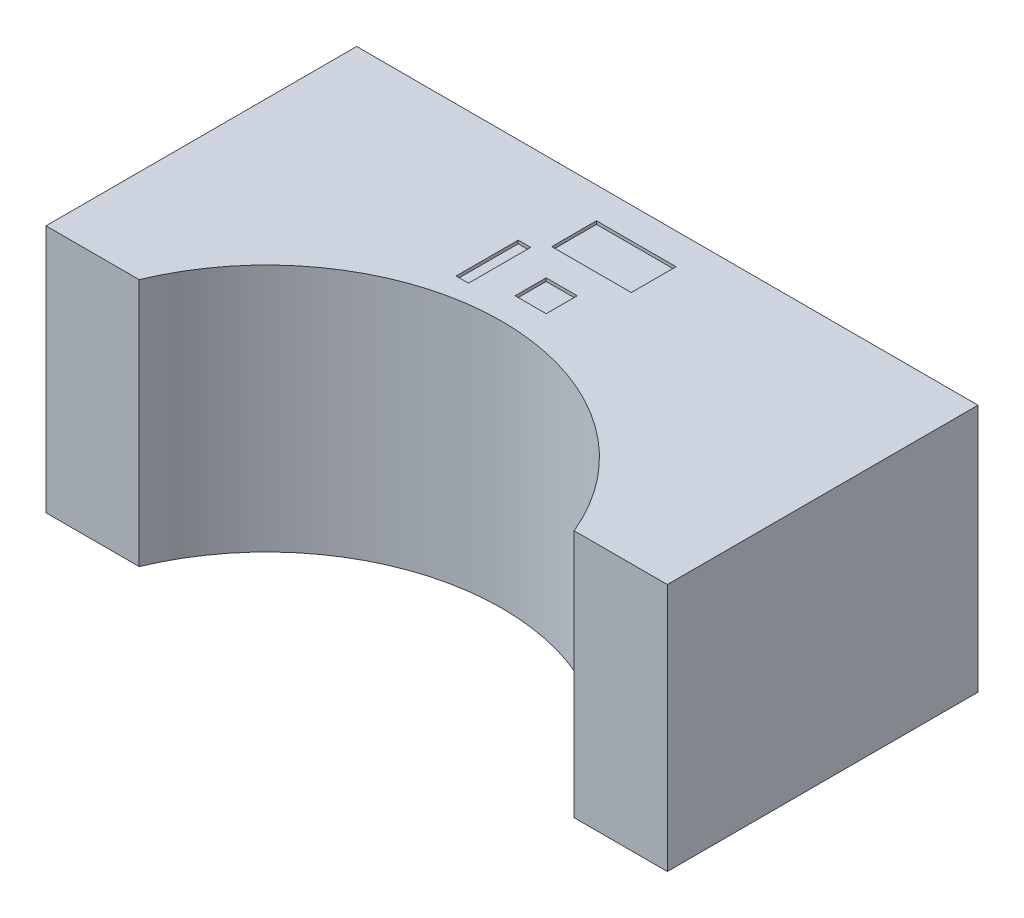
ISO-10303-21;
HEADER;
FILE_DESCRIPTION(('STEP AP214'),'2;1');
FILE_NAME('part.step','',(''),(''),'','','');
FILE_SCHEMA(('AUTOMOTIVE_DESIGN { 1 0 10303 214 1 1 1 1 }'));
ENDSEC;
DATA;
#1=APPLICATION_CONTEXT('core data for automotive mechanical design processes');
#2=APPLICATION_PROTOCOL_DEFINITION('international standard','automotive_design',2000,#1);
#3=PRODUCT_CONTEXT('',#1,'mechanical');
#4=PRODUCT('Part','Part','',(#3));
#5=PRODUCT_RELATED_PRODUCT_CATEGORY('part','',(#4));
#6=PRODUCT_DEFINITION_FORMATION('','',#4);
#7=PRODUCT_DEFINITION_CONTEXT('part definition',#1,'design');
#8=PRODUCT_DEFINITION('design','',#6,#7);
#9=PRODUCT_DEFINITION_SHAPE('','',#8);
#10=(LENGTH_UNIT() NAMED_UNIT(*) SI_UNIT(.MILLI.,.METRE.));
#11=(NAMED_UNIT(*) PLANE_ANGLE_UNIT() SI_UNIT($,.RADIAN.));
#12=(NAMED_UNIT(*) SI_UNIT($,.STERADIAN.) SOLID_ANGLE_UNIT());
#13=UNCERTAINTY_MEASURE_WITH_UNIT(LENGTH_MEASURE(1.E-05),#10,'distance_accuracy_value','');
#14=(GEOMETRIC_REPRESENTATION_CONTEXT(3) GLOBAL_UNCERTAINTY_ASSIGNED_CONTEXT((#13)) GLOBAL_UNIT_ASSIGNED_CONTEXT((#10,
#11,#12)) REPRESENTATION_CONTEXT('',''));
#15=CARTESIAN_POINT('',(0.,0.,0.));
#16=DIRECTION('',(0.,0.,1.));
#17=DIRECTION('',(1.,0.,0.));
#18=AXIS2_PLACEMENT_3D('',#15,#16,#17);
#19=CARTESIAN_POINT('',(-500.,400.,0.));
#20=DIRECTION('',(1.,0.,0.));
#21=DIRECTION('',(0.,0.,-1.));
#22=AXIS2_PLACEMENT_3D('',#19,#20,#21);
#23=PLANE('',#22);
#24=DIRECTION('',(0.,0.,1.));
#25=VECTOR('',#24,1.);
#26=CARTESIAN_POINT('',(-500.,0.,0.));
#27=LINE('',#26,#25);
#28=CARTESIAN_POINT('',(-500.,0.,0.));
#29=VERTEX_POINT('',#28);
#30=CARTESIAN_POINT('',(-500.,0.,500.));
#31=VERTEX_POINT('',#30);
#32=EDGE_CURVE('E253',#29,#31,#27,.T.);
#33=ORIENTED_EDGE('',*,*,#32,.T.);
#34=DIRECTION('',(0.,-1.,0.));
#35=VECTOR('',#34,1.);
#36=CARTESIAN_POINT('',(-500.,400.,500.));
#37=LINE('',#36,#35);
#38=CARTESIAN_POINT('',(-500.,400.,500.));
#39=VERTEX_POINT('',#38);
#40=EDGE_CURVE('E42',#39,#31,#37,.T.);
#41=ORIENTED_EDGE('',*,*,#40,.F.);
#42=DIRECTION('',(0.,0.,1.));
#43=VECTOR('',#42,1.);
#44=CARTESIAN_POINT('',(-500.,400.,0.));
#45=LINE('',#44,#43);
#46=CARTESIAN_POINT('',(-500.,400.,0.));
#47=VERTEX_POINT('',#46);
#48=EDGE_CURVE('E263',#47,#39,#45,.T.);
#49=ORIENTED_EDGE('',*,*,#48,.F.);
#50=DIRECTION('',(0.,-1.,0.));
#51=VECTOR('',#50,1.);
#52=CARTESIAN_POINT('',(-500.,400.,0.));
#53=LINE('',#52,#51);
#54=EDGE_CURVE('E11',#47,#29,#53,.T.);
#55=ORIENTED_EDGE('',*,*,#54,.T.);
#56=EDGE_LOOP('',(#33,#41,#49,#55));
#57=FACE_BOUND('',#56,.T.);
#58=ADVANCED_FACE('F35',(#57),#23,.F.);
#59=CARTESIAN_POINT('',(-500.,400.,500.));
#60=DIRECTION('',(0.,0.,-1.));
#61=DIRECTION('',(-1.,0.,0.));
#62=AXIS2_PLACEMENT_3D('',#59,#60,#61);
#63=PLANE('',#62);
#64=DIRECTION('',(1.,0.,0.));
#65=VECTOR('',#64,1.);
#66=CARTESIAN_POINT('',(-500.,0.,500.));
#67=LINE('',#66,#65);
#68=CARTESIAN_POINT('',(-350.,0.,500.));
#69=VERTEX_POINT('',#68);
#70=EDGE_CURVE('E277',#31,#69,#67,.T.);
#71=ORIENTED_EDGE('',*,*,#70,.T.);
#72=DIRECTION('',(0.,-1.,0.));
#73=VECTOR('',#72,1.);
#74=CARTESIAN_POINT('',(-350.,400.,500.));
#75=LINE('',#74,#73);
#76=CARTESIAN_POINT('',(-350.,400.,500.));
#77=VERTEX_POINT('',#76);
#78=EDGE_CURVE('E294',#77,#69,#75,.T.);
#79=ORIENTED_EDGE('',*,*,#78,.F.);
#80=DIRECTION('',(1.,0.,0.));
#81=VECTOR('',#80,1.);
#82=CARTESIAN_POINT('',(-500.,400.,500.));
#83=LINE('',#82,#81);
#84=EDGE_CURVE('E266',#39,#77,#83,.T.);
#85=ORIENTED_EDGE('',*,*,#84,.F.);
#86=ORIENTED_EDGE('',*,*,#40,.T.);
#87=EDGE_LOOP('',(#71,#79,#85,#86));
#88=FACE_BOUND('',#87,.T.);
#89=ADVANCED_FACE('F301',(#88),#63,.F.);
#90=CARTESIAN_POINT('',(1.38777878078145E-13,400.,644.974746830582));
#91=DIRECTION('',(0.,-1.,0.));
#92=DIRECTION('',(0.,0.,-1.));
#93=AXIS2_PLACEMENT_3D('',#90,#91,#92);
#94=CYLINDRICAL_SURFACE('',#93,378.837270102337);
#95=CARTESIAN_POINT('',(1.38777878078145E-13,0.,644.974746830582));
#96=DIRECTION('',(0.,-1.,0.));
#97=DIRECTION('',(0.,0.,-1.));
#98=AXIS2_PLACEMENT_3D('',#95,#96,#97);
#99=CIRCLE('',#98,378.837270102337);
#100=CARTESIAN_POINT('',(350.,0.,500.));
#101=VERTEX_POINT('',#100);
#102=EDGE_CURVE('E279',#69,#101,#99,.T.);
#103=ORIENTED_EDGE('',*,*,#102,.T.);
#104=DIRECTION('',(0.,-1.,0.));
#105=VECTOR('',#104,1.);
#106=CARTESIAN_POINT('',(350.,400.,500.));
#107=LINE('',#106,#105);
#108=CARTESIAN_POINT('',(350.,400.,500.));
#109=VERTEX_POINT('',#108);
#110=EDGE_CURVE('E291',#109,#101,#107,.T.);
#111=ORIENTED_EDGE('',*,*,#110,.F.);
#112=CARTESIAN_POINT('',(1.38777878078145E-13,400.,644.974746830582));
#113=DIRECTION('',(0.,-1.,0.));
#114=DIRECTION('',(0.,0.,-1.));
#115=AXIS2_PLACEMENT_3D('',#112,#113,#114);
#116=CIRCLE('',#115,378.837270102337);
#117=EDGE_CURVE('E268',#77,#109,#116,.T.);
#118=ORIENTED_EDGE('',*,*,#117,.F.);
#119=ORIENTED_EDGE('',*,*,#78,.T.);
#120=EDGE_LOOP('',(#103,#111,#118,#119));
#121=FACE_BOUND('',#120,.T.);
#122=ADVANCED_FACE('F313',(#121),#94,.F.);
#123=CARTESIAN_POINT('',(500.,400.,500.));
#124=DIRECTION('',(0.,0.,-1.));
#125=DIRECTION('',(-1.,0.,0.));
#126=AXIS2_PLACEMENT_3D('',#123,#124,#125);
#127=PLANE('',#126);
#128=DIRECTION('',(1.,0.,0.));
#129=VECTOR('',#128,1.);
#130=CARTESIAN_POINT('',(500.,0.,500.));
#131=LINE('',#130,#129);
#132=CARTESIAN_POINT('',(500.,0.,500.));
#133=VERTEX_POINT('',#132);
#134=EDGE_CURVE('E281',#101,#133,#131,.T.);
#135=ORIENTED_EDGE('',*,*,#134,.T.);
#136=DIRECTION('',(0.,-1.,0.));
#137=VECTOR('',#136,1.);
#138=CARTESIAN_POINT('',(500.,400.,500.));
#139=LINE('',#138,#137);
#140=CARTESIAN_POINT('',(500.,400.,500.));
#141=VERTEX_POINT('',#140);
#142=EDGE_CURVE('E288',#141,#133,#139,.T.);
#143=ORIENTED_EDGE('',*,*,#142,.F.);
#144=DIRECTION('',(1.,0.,0.));
#145=VECTOR('',#144,1.);
#146=CARTESIAN_POINT('',(500.,400.,500.));
#147=LINE('',#146,#145);
#148=EDGE_CURVE('E270',#109,#141,#147,.T.);
#149=ORIENTED_EDGE('',*,*,#148,.F.);
#150=ORIENTED_EDGE('',*,*,#110,.T.);
#151=EDGE_LOOP('',(#135,#143,#149,#150));
#152=FACE_BOUND('',#151,.T.);
#153=ADVANCED_FACE('F317',(#152),#127,.F.);
#154=CARTESIAN_POINT('',(500.,400.,0.));
#155=DIRECTION('',(-1.,0.,0.));
#156=DIRECTION('',(0.,0.,1.));
#157=AXIS2_PLACEMENT_3D('',#154,#155,#156);
#158=PLANE('',#157);
#159=DIRECTION('',(0.,0.,-1.));
#160=VECTOR('',#159,1.);
#161=CARTESIAN_POINT('',(500.,0.,0.));
#162=LINE('',#161,#160);
#163=CARTESIAN_POINT('',(500.,0.,0.));
#164=VERTEX_POINT('',#163);
#165=EDGE_CURVE('E283',#133,#164,#162,.T.);
#166=ORIENTED_EDGE('',*,*,#165,.T.);
#167=DIRECTION('',(0.,-1.,0.));
#168=VECTOR('',#167,1.);
#169=CARTESIAN_POINT('',(500.,400.,0.));
#170=LINE('',#169,#168);
#171=CARTESIAN_POINT('',(500.,400.,0.));
#172=VERTEX_POINT('',#171);
#173=EDGE_CURVE('E275',#172,#164,#170,.T.);
#174=ORIENTED_EDGE('',*,*,#173,.F.);
#175=DIRECTION('',(0.,0.,-1.));
#176=VECTOR('',#175,1.);
#177=CARTESIAN_POINT('',(500.,400.,0.));
#178=LINE('',#177,#176);
#179=EDGE_CURVE('E272',#141,#172,#178,.T.);
#180=ORIENTED_EDGE('',*,*,#179,.F.);
#181=ORIENTED_EDGE('',*,*,#142,.T.);
#182=EDGE_LOOP('',(#166,#174,#180,#181));
#183=FACE_BOUND('',#182,.T.);
#184=ADVANCED_FACE('F327',(#183),#158,.F.);
#185=CARTESIAN_POINT('',(0.,400.,0.));
#186=DIRECTION('',(0.,0.,1.));
#187=DIRECTION('',(1.,0.,0.));
#188=AXIS2_PLACEMENT_3D('',#185,#186,#187);
#189=PLANE('',#188);
#190=DIRECTION('',(-1.,0.,0.));
#191=VECTOR('',#190,1.);
#192=CARTESIAN_POINT('',(0.,0.,0.));
#193=LINE('',#192,#191);
#194=EDGE_CURVE('E264',#164,#29,#193,.T.);
#195=ORIENTED_EDGE('',*,*,#194,.T.);
#196=ORIENTED_EDGE('',*,*,#54,.F.);
#197=DIRECTION('',(-1.,0.,0.));
#198=VECTOR('',#197,1.);
#199=CARTESIAN_POINT('',(0.,400.,0.));
#200=LINE('',#199,#198);
#201=EDGE_CURVE('E260',#172,#47,#200,.T.);
#202=ORIENTED_EDGE('',*,*,#201,.F.);
#203=ORIENTED_EDGE('',*,*,#173,.T.);
#204=EDGE_LOOP('',(#195,#196,#202,#203));
#205=FACE_BOUND('',#204,.T.);
#206=ADVANCED_FACE('F325',(#205),#189,.F.);
#207=CARTESIAN_POINT('',(1.38777878078145E-13,400.,644.974746830582));
#208=DIRECTION('',(0.,-1.,0.));
#209=DIRECTION('',(0.,0.,-1.));
#210=AXIS2_PLACEMENT_3D('',#207,#208,#209);
#211=PLANE('',#210);
#212=DIRECTION('',(1.,0.,0.));
#213=VECTOR('',#212,1.);
#214=CARTESIAN_POINT('',(-100.,400.,240.));
#215=LINE('',#214,#213);
#216=CARTESIAN_POINT('',(-100.,400.,240.));
#217=VERTEX_POINT('',#216);
#218=CARTESIAN_POINT('',(-80.,400.,240.));
#219=VERTEX_POINT('',#218);
#220=EDGE_CURVE('E188',#217,#219,#215,.T.);
#221=ORIENTED_EDGE('',*,*,#220,.F.);
#222=DIRECTION('',(0.,0.,1.));
#223=VECTOR('',#222,1.);
#224=CARTESIAN_POINT('',(-100.,400.,140.));
#225=LINE('',#224,#223);
#226=CARTESIAN_POINT('',(-100.,400.,140.));
#227=VERTEX_POINT('',#226);
#228=EDGE_CURVE('E49',#227,#217,#225,.T.);
#229=ORIENTED_EDGE('',*,*,#228,.F.);
#230=DIRECTION('',(-1.,0.,0.));
#231=VECTOR('',#230,1.);
#232=CARTESIAN_POINT('',(-100.,400.,140.));
#233=LINE('',#232,#231);
#234=CARTESIAN_POINT('',(-80.,400.,140.));
#235=VERTEX_POINT('',#234);
#236=EDGE_CURVE('E179',#235,#227,#233,.T.);
#237=ORIENTED_EDGE('',*,*,#236,.F.);
#238=DIRECTION('',(0.,0.,-1.));
#239=VECTOR('',#238,1.);
#240=CARTESIAN_POINT('',(-80.,400.,140.));
#241=LINE('',#240,#239);
#242=EDGE_CURVE('E182',#219,#235,#241,.T.);
#243=ORIENTED_EDGE('',*,*,#242,.F.);
#244=EDGE_LOOP('',(#221,#229,#237,#243));
#245=FACE_BOUND('',#244,.T.);
#246=DIRECTION('',(1.,0.,0.));
#247=VECTOR('',#246,1.);
#248=CARTESIAN_POINT('',(-25.,400.,220.));
#249=LINE('',#248,#247);
#250=CARTESIAN_POINT('',(-25.,400.,220.));
#251=VERTEX_POINT('',#250);
#252=CARTESIAN_POINT('',(25.,400.,220.));
#253=VERTEX_POINT('',#252);
#254=EDGE_CURVE('E212',#251,#253,#249,.T.);
#255=ORIENTED_EDGE('',*,*,#254,.F.);
#256=DIRECTION('',(0.,0.,1.));
#257=VECTOR('',#256,1.);
#258=CARTESIAN_POINT('',(-25.,400.,170.));
#259=LINE('',#258,#257);
#260=CARTESIAN_POINT('',(-25.,400.,170.));
#261=VERTEX_POINT('',#260);
#262=EDGE_CURVE('E57',#261,#251,#259,.T.);
#263=ORIENTED_EDGE('',*,*,#262,.F.);
#264=DIRECTION('',(-1.,0.,0.));
#265=VECTOR('',#264,1.);
#266=CARTESIAN_POINT('',(-25.,400.,170.));
#267=LINE('',#266,#265);
#268=CARTESIAN_POINT('',(25.,400.,170.));
#269=VERTEX_POINT('',#268);
#270=EDGE_CURVE('E201',#269,#261,#267,.T.);
#271=ORIENTED_EDGE('',*,*,#270,.F.);
#272=DIRECTION('',(0.,0.,-1.));
#273=VECTOR('',#272,1.);
#274=CARTESIAN_POINT('',(25.,400.,170.));
#275=LINE('',#274,#273);
#276=EDGE_CURVE('E215',#253,#269,#275,.T.);
#277=ORIENTED_EDGE('',*,*,#276,.F.);
#278=EDGE_LOOP('',(#255,#263,#271,#277));
#279=FACE_BOUND('',#278,.T.);
#280=DIRECTION('',(1.,0.,0.));
#281=VECTOR('',#280,1.);
#282=CARTESIAN_POINT('',(-64.,400.,122.));
#283=LINE('',#282,#281);
#284=CARTESIAN_POINT('',(-64.,400.,122.));
#285=VERTEX_POINT('',#284);
#286=CARTESIAN_POINT('',(64.,400.,122.));
#287=VERTEX_POINT('',#286);
#288=EDGE_CURVE('E243',#285,#287,#283,.T.);
#289=ORIENTED_EDGE('',*,*,#288,.F.);
#290=DIRECTION('',(0.,0.,1.));
#291=VECTOR('',#290,1.);
#292=CARTESIAN_POINT('',(-64.,400.,50.));
#293=LINE('',#292,#291);
#294=CARTESIAN_POINT('',(-64.,400.,50.));
#295=VERTEX_POINT('',#294);
#296=EDGE_CURVE('E222',#295,#285,#293,.T.);
#297=ORIENTED_EDGE('',*,*,#296,.F.);
#298=DIRECTION('',(-1.,0.,0.));
#299=VECTOR('',#298,1.);
#300=CARTESIAN_POINT('',(-64.,400.,50.));
#301=LINE('',#300,#299);
#302=CARTESIAN_POINT('',(64.,400.,50.));
#303=VERTEX_POINT('',#302);
#304=EDGE_CURVE('E232',#303,#295,#301,.T.);
#305=ORIENTED_EDGE('',*,*,#304,.F.);
#306=DIRECTION('',(0.,0.,-1.));
#307=VECTOR('',#306,1.);
#308=CARTESIAN_POINT('',(64.,400.,122.));
#309=LINE('',#308,#307);
#310=EDGE_CURVE('E246',#287,#303,#309,.T.);
#311=ORIENTED_EDGE('',*,*,#310,.F.);
#312=EDGE_LOOP('',(#289,#297,#305,#311));
#313=FACE_BOUND('',#312,.T.);
#314=ORIENTED_EDGE('',*,*,#201,.T.);
#315=ORIENTED_EDGE('',*,*,#48,.T.);
#316=ORIENTED_EDGE('',*,*,#84,.T.);
#317=ORIENTED_EDGE('',*,*,#117,.T.);
#318=ORIENTED_EDGE('',*,*,#148,.T.);
#319=ORIENTED_EDGE('',*,*,#179,.T.);
#320=EDGE_LOOP('',(#314,#315,#316,#317,#318,#319));
#321=FACE_BOUND('',#320,.T.);
#322=ADVANCED_FACE('F321',(#245,#279,#313,#321),#211,.F.);
#323=CARTESIAN_POINT('',(1.38777878078145E-13,0.,644.974746830582));
#324=DIRECTION('',(0.,-1.,0.));
#325=DIRECTION('',(0.,0.,-1.));
#326=AXIS2_PLACEMENT_3D('',#323,#324,#325);
#327=PLANE('',#326);
#328=ORIENTED_EDGE('',*,*,#32,.F.);
#329=ORIENTED_EDGE('',*,*,#194,.F.);
#330=ORIENTED_EDGE('',*,*,#165,.F.);
#331=ORIENTED_EDGE('',*,*,#134,.F.);
#332=ORIENTED_EDGE('',*,*,#102,.F.);
#333=ORIENTED_EDGE('',*,*,#70,.F.);
#334=EDGE_LOOP('',(#328,#329,#330,#331,#332,#333));
#335=FACE_BOUND('',#334,.T.);
#336=ADVANCED_FACE('F307',(#335),#327,.T.);
#337=CARTESIAN_POINT('',(-64.,395.,50.));
#338=DIRECTION('',(-1.,0.,0.));
#339=DIRECTION('',(0.,0.,1.));
#340=AXIS2_PLACEMENT_3D('',#337,#338,#339);
#341=PLANE('',#340);
#342=ORIENTED_EDGE('',*,*,#296,.T.);
#343=DIRECTION('',(0.,1.,0.));
#344=VECTOR('',#343,1.);
#345=CARTESIAN_POINT('',(-64.,395.,122.));
#346=LINE('',#345,#344);
#347=CARTESIAN_POINT('',(-64.,395.,122.));
#348=VERTEX_POINT('',#347);
#349=EDGE_CURVE('E241',#348,#285,#346,.T.);
#350=ORIENTED_EDGE('',*,*,#349,.F.);
#351=DIRECTION('',(0.,0.,1.));
#352=VECTOR('',#351,1.);
#353=CARTESIAN_POINT('',(-64.,395.,50.));
#354=LINE('',#353,#352);
#355=CARTESIAN_POINT('',(-64.,395.,50.));
#356=VERTEX_POINT('',#355);
#357=EDGE_CURVE('E228',#356,#348,#354,.T.);
#358=ORIENTED_EDGE('',*,*,#357,.F.);
#359=DIRECTION('',(0.,1.,0.));
#360=VECTOR('',#359,1.);
#361=CARTESIAN_POINT('',(-64.,395.,50.));
#362=LINE('',#361,#360);
#363=EDGE_CURVE('E251',#356,#295,#362,.T.);
#364=ORIENTED_EDGE('',*,*,#363,.T.);
#365=EDGE_LOOP('',(#342,#350,#358,#364));
#366=FACE_BOUND('',#365,.T.);
#367=ADVANCED_FACE('F372',(#366),#341,.F.);
#368=CARTESIAN_POINT('',(-64.,395.,50.));
#369=DIRECTION('',(0.,0.,-1.));
#370=DIRECTION('',(-1.,0.,0.));
#371=AXIS2_PLACEMENT_3D('',#368,#369,#370);
#372=PLANE('',#371);
#373=ORIENTED_EDGE('',*,*,#304,.T.);
#374=ORIENTED_EDGE('',*,*,#363,.F.);
#375=DIRECTION('',(-1.,0.,0.));
#376=VECTOR('',#375,1.);
#377=CARTESIAN_POINT('',(-64.,395.,50.));
#378=LINE('',#377,#376);
#379=CARTESIAN_POINT('',(64.,395.,50.));
#380=VERTEX_POINT('',#379);
#381=EDGE_CURVE('E238',#380,#356,#378,.T.);
#382=ORIENTED_EDGE('',*,*,#381,.F.);
#383=DIRECTION('',(0.,1.,0.));
#384=VECTOR('',#383,1.);
#385=CARTESIAN_POINT('',(64.,395.,50.));
#386=LINE('',#385,#384);
#387=EDGE_CURVE('E254',#380,#303,#386,.T.);
#388=ORIENTED_EDGE('',*,*,#387,.T.);
#389=EDGE_LOOP('',(#373,#374,#382,#388));
#390=FACE_BOUND('',#389,.T.);
#391=ADVANCED_FACE('F381',(#390),#372,.F.);
#392=CARTESIAN_POINT('',(64.,395.,122.));
#393=DIRECTION('',(1.,0.,0.));
#394=DIRECTION('',(0.,0.,-1.));
#395=AXIS2_PLACEMENT_3D('',#392,#393,#394);
#396=PLANE('',#395);
#397=ORIENTED_EDGE('',*,*,#310,.T.);
#398=ORIENTED_EDGE('',*,*,#387,.F.);
#399=DIRECTION('',(0.,0.,-1.));
#400=VECTOR('',#399,1.);
#401=CARTESIAN_POINT('',(64.,395.,122.));
#402=LINE('',#401,#400);
#403=CARTESIAN_POINT('',(64.,395.,122.));
#404=VERTEX_POINT('',#403);
#405=EDGE_CURVE('E235',#404,#380,#402,.T.);
#406=ORIENTED_EDGE('',*,*,#405,.F.);
#407=DIRECTION('',(0.,1.,0.));
#408=VECTOR('',#407,1.);
#409=CARTESIAN_POINT('',(64.,395.,122.));
#410=LINE('',#409,#408);
#411=EDGE_CURVE('E256',#404,#287,#410,.T.);
#412=ORIENTED_EDGE('',*,*,#411,.T.);
#413=EDGE_LOOP('',(#397,#398,#406,#412));
#414=FACE_BOUND('',#413,.T.);
#415=ADVANCED_FACE('F391',(#414),#396,.F.);
#416=CARTESIAN_POINT('',(-64.,395.,122.));
#417=DIRECTION('',(0.,0.,1.));
#418=DIRECTION('',(1.,0.,0.));
#419=AXIS2_PLACEMENT_3D('',#416,#417,#418);
#420=PLANE('',#419);
#421=ORIENTED_EDGE('',*,*,#288,.T.);
#422=ORIENTED_EDGE('',*,*,#411,.F.);
#423=DIRECTION('',(1.,0.,0.));
#424=VECTOR('',#423,1.);
#425=CARTESIAN_POINT('',(-64.,395.,122.));
#426=LINE('',#425,#424);
#427=EDGE_CURVE('E231',#348,#404,#426,.T.);
#428=ORIENTED_EDGE('',*,*,#427,.F.);
#429=ORIENTED_EDGE('',*,*,#349,.T.);
#430=EDGE_LOOP('',(#421,#422,#428,#429));
#431=FACE_BOUND('',#430,.T.);
#432=ADVANCED_FACE('F401',(#431),#420,.F.);
#433=CARTESIAN_POINT('',(0.,395.,0.));
#434=DIRECTION('',(0.,1.,0.));
#435=DIRECTION('',(0.,0.,1.));
#436=AXIS2_PLACEMENT_3D('',#433,#434,#435);
#437=PLANE('',#436);
#438=ORIENTED_EDGE('',*,*,#357,.T.);
#439=ORIENTED_EDGE('',*,*,#427,.T.);
#440=ORIENTED_EDGE('',*,*,#405,.T.);
#441=ORIENTED_EDGE('',*,*,#381,.T.);
#442=EDGE_LOOP('',(#438,#439,#440,#441));
#443=FACE_BOUND('',#442,.T.);
#444=ADVANCED_FACE('F411',(#443),#437,.T.);
#445=CARTESIAN_POINT('',(-25.,395.,170.));
#446=DIRECTION('',(-1.,0.,0.));
#447=DIRECTION('',(0.,0.,1.));
#448=AXIS2_PLACEMENT_3D('',#445,#446,#447);
#449=PLANE('',#448);
#450=ORIENTED_EDGE('',*,*,#262,.T.);
#451=DIRECTION('',(0.,1.,0.));
#452=VECTOR('',#451,1.);
#453=CARTESIAN_POINT('',(-25.,395.,220.));
#454=LINE('',#453,#452);
#455=CARTESIAN_POINT('',(-25.,395.,220.));
#456=VERTEX_POINT('',#455);
#457=EDGE_CURVE('E210',#456,#251,#454,.T.);
#458=ORIENTED_EDGE('',*,*,#457,.F.);
#459=DIRECTION('',(0.,0.,1.));
#460=VECTOR('',#459,1.);
#461=CARTESIAN_POINT('',(-25.,395.,170.));
#462=LINE('',#461,#460);
#463=CARTESIAN_POINT('',(-25.,395.,170.));
#464=VERTEX_POINT('',#463);
#465=EDGE_CURVE('E197',#464,#456,#462,.T.);
#466=ORIENTED_EDGE('',*,*,#465,.F.);
#467=DIRECTION('',(0.,1.,0.));
#468=VECTOR('',#467,1.);
#469=CARTESIAN_POINT('',(-25.,395.,170.));
#470=LINE('',#469,#468);
#471=EDGE_CURVE('E220',#464,#261,#470,.T.);
#472=ORIENTED_EDGE('',*,*,#471,.T.);
#473=EDGE_LOOP('',(#450,#458,#466,#472));
#474=FACE_BOUND('',#473,.T.);
#475=ADVANCED_FACE('F421',(#474),#449,.F.);
#476=CARTESIAN_POINT('',(-25.,395.,170.));
#477=DIRECTION('',(0.,0.,-1.));
#478=DIRECTION('',(-1.,0.,0.));
#479=AXIS2_PLACEMENT_3D('',#476,#477,#478);
#480=PLANE('',#479);
#481=ORIENTED_EDGE('',*,*,#270,.T.);
#482=ORIENTED_EDGE('',*,*,#471,.F.);
#483=DIRECTION('',(-1.,0.,0.));
#484=VECTOR('',#483,1.);
#485=CARTESIAN_POINT('',(-25.,395.,170.));
#486=LINE('',#485,#484);
#487=CARTESIAN_POINT('',(25.,395.,170.));
#488=VERTEX_POINT('',#487);
#489=EDGE_CURVE('E207',#488,#464,#486,.T.);
#490=ORIENTED_EDGE('',*,*,#489,.F.);
#491=DIRECTION('',(0.,1.,0.));
#492=VECTOR('',#491,1.);
#493=CARTESIAN_POINT('',(25.,395.,170.));
#494=LINE('',#493,#492);
#495=EDGE_CURVE('E223',#488,#269,#494,.T.);
#496=ORIENTED_EDGE('',*,*,#495,.T.);
#497=EDGE_LOOP('',(#481,#482,#490,#496));
#498=FACE_BOUND('',#497,.T.);
#499=ADVANCED_FACE('F431',(#498),#480,.F.);
#500=CARTESIAN_POINT('',(25.,395.,170.));
#501=DIRECTION('',(1.,0.,0.));
#502=DIRECTION('',(0.,0.,-1.));
#503=AXIS2_PLACEMENT_3D('',#500,#501,#502);
#504=PLANE('',#503);
#505=ORIENTED_EDGE('',*,*,#276,.T.);
#506=ORIENTED_EDGE('',*,*,#495,.F.);
#507=DIRECTION('',(0.,0.,-1.));
#508=VECTOR('',#507,1.);
#509=CARTESIAN_POINT('',(25.,395.,170.));
#510=LINE('',#509,#508);
#511=CARTESIAN_POINT('',(25.,395.,220.));
#512=VERTEX_POINT('',#511);
#513=EDGE_CURVE('E204',#512,#488,#510,.T.);
#514=ORIENTED_EDGE('',*,*,#513,.F.);
#515=DIRECTION('',(0.,1.,0.));
#516=VECTOR('',#515,1.);
#517=CARTESIAN_POINT('',(25.,395.,220.));
#518=LINE('',#517,#516);
#519=EDGE_CURVE('E225',#512,#253,#518,.T.);
#520=ORIENTED_EDGE('',*,*,#519,.T.);
#521=EDGE_LOOP('',(#505,#506,#514,#520));
#522=FACE_BOUND('',#521,.T.);
#523=ADVANCED_FACE('F440',(#522),#504,.F.);
#524=CARTESIAN_POINT('',(-25.,395.,220.));
#525=DIRECTION('',(0.,0.,1.));
#526=DIRECTION('',(1.,0.,0.));
#527=AXIS2_PLACEMENT_3D('',#524,#525,#526);
#528=PLANE('',#527);
#529=ORIENTED_EDGE('',*,*,#254,.T.);
#530=ORIENTED_EDGE('',*,*,#519,.F.);
#531=DIRECTION('',(1.,0.,0.));
#532=VECTOR('',#531,1.);
#533=CARTESIAN_POINT('',(-25.,395.,220.));
#534=LINE('',#533,#532);
#535=EDGE_CURVE('E200',#456,#512,#534,.T.);
#536=ORIENTED_EDGE('',*,*,#535,.F.);
#537=ORIENTED_EDGE('',*,*,#457,.T.);
#538=EDGE_LOOP('',(#529,#530,#536,#537));
#539=FACE_BOUND('',#538,.T.);
#540=ADVANCED_FACE('F450',(#539),#528,.F.);
#541=CARTESIAN_POINT('',(0.,395.,0.));
#542=DIRECTION('',(0.,1.,0.));
#543=DIRECTION('',(0.,0.,1.));
#544=AXIS2_PLACEMENT_3D('',#541,#542,#543);
#545=PLANE('',#544);
#546=ORIENTED_EDGE('',*,*,#465,.T.);
#547=ORIENTED_EDGE('',*,*,#535,.T.);
#548=ORIENTED_EDGE('',*,*,#513,.T.);
#549=ORIENTED_EDGE('',*,*,#489,.T.);
#550=EDGE_LOOP('',(#546,#547,#548,#549));
#551=FACE_BOUND('',#550,.T.);
#552=ADVANCED_FACE('F460',(#551),#545,.T.);
#553=CARTESIAN_POINT('',(-100.,395.,140.));
#554=DIRECTION('',(-1.,0.,0.));
#555=DIRECTION('',(0.,0.,1.));
#556=AXIS2_PLACEMENT_3D('',#553,#554,#555);
#557=PLANE('',#556);
#558=ORIENTED_EDGE('',*,*,#228,.T.);
#559=DIRECTION('',(0.,1.,0.));
#560=VECTOR('',#559,1.);
#561=CARTESIAN_POINT('',(-100.,395.,240.));
#562=LINE('',#561,#560);
#563=CARTESIAN_POINT('',(-100.,395.,240.));
#564=VERTEX_POINT('',#563);
#565=EDGE_CURVE('E157',#564,#217,#562,.T.);
#566=ORIENTED_EDGE('',*,*,#565,.F.);
#567=DIRECTION('',(0.,0.,1.));
#568=VECTOR('',#567,1.);
#569=CARTESIAN_POINT('',(-100.,395.,140.));
#570=LINE('',#569,#568);
#571=CARTESIAN_POINT('',(-100.,395.,140.));
#572=VERTEX_POINT('',#571);
#573=EDGE_CURVE('E161',#572,#564,#570,.T.);
#574=ORIENTED_EDGE('',*,*,#573,.F.);
#575=DIRECTION('',(0.,1.,0.));
#576=VECTOR('',#575,1.);
#577=CARTESIAN_POINT('',(-100.,395.,140.));
#578=LINE('',#577,#576);
#579=EDGE_CURVE('E192',#572,#227,#578,.T.);
#580=ORIENTED_EDGE('',*,*,#579,.T.);
#581=EDGE_LOOP('',(#558,#566,#574,#580));
#582=FACE_BOUND('',#581,.T.);
#583=ADVANCED_FACE('F159',(#582),#557,.F.);
#584=CARTESIAN_POINT('',(-100.,395.,140.));
#585=DIRECTION('',(0.,0.,-1.));
#586=DIRECTION('',(-1.,0.,0.));
#587=AXIS2_PLACEMENT_3D('',#584,#585,#586);
#588=PLANE('',#587);
#589=ORIENTED_EDGE('',*,*,#236,.T.);
#590=ORIENTED_EDGE('',*,*,#579,.F.);
#591=DIRECTION('',(-1.,0.,0.));
#592=VECTOR('',#591,1.);
#593=CARTESIAN_POINT('',(-100.,395.,140.));
#594=LINE('',#593,#592);
#595=CARTESIAN_POINT('',(-80.,395.,140.));
#596=VERTEX_POINT('',#595);
#597=EDGE_CURVE('E167',#596,#572,#594,.T.);
#598=ORIENTED_EDGE('',*,*,#597,.F.);
#599=DIRECTION('',(0.,1.,0.));
#600=VECTOR('',#599,1.);
#601=CARTESIAN_POINT('',(-80.,395.,140.));
#602=LINE('',#601,#600);
#603=EDGE_CURVE('E194',#596,#235,#602,.T.);
#604=ORIENTED_EDGE('',*,*,#603,.T.);
#605=EDGE_LOOP('',(#589,#590,#598,#604));
#606=FACE_BOUND('',#605,.T.);
#607=ADVANCED_FACE('F486',(#606),#588,.F.);
#608=CARTESIAN_POINT('',(-80.,395.,140.));
#609=DIRECTION('',(1.,0.,0.));
#610=DIRECTION('',(0.,0.,-1.));
#611=AXIS2_PLACEMENT_3D('',#608,#609,#610);
#612=PLANE('',#611);
#613=ORIENTED_EDGE('',*,*,#242,.T.);
#614=ORIENTED_EDGE('',*,*,#603,.F.);
#615=DIRECTION('',(0.,0.,-1.));
#616=VECTOR('',#615,1.);
#617=CARTESIAN_POINT('',(-80.,395.,140.));
#618=LINE('',#617,#616);
#619=CARTESIAN_POINT('',(-80.,395.,240.));
#620=VERTEX_POINT('',#619);
#621=EDGE_CURVE('E175',#620,#596,#618,.T.);
#622=ORIENTED_EDGE('',*,*,#621,.F.);
#623=DIRECTION('',(0.,1.,0.));
#624=VECTOR('',#623,1.);
#625=CARTESIAN_POINT('',(-80.,395.,240.));
#626=LINE('',#625,#624);
#627=EDGE_CURVE('E166',#620,#219,#626,.T.);
#628=ORIENTED_EDGE('',*,*,#627,.T.);
#629=EDGE_LOOP('',(#613,#614,#622,#628));
#630=FACE_BOUND('',#629,.T.);
#631=ADVANCED_FACE('F495',(#630),#612,.F.);
#632=CARTESIAN_POINT('',(-100.,395.,240.));
#633=DIRECTION('',(0.,0.,1.));
#634=DIRECTION('',(1.,0.,0.));
#635=AXIS2_PLACEMENT_3D('',#632,#633,#634);
#636=PLANE('',#635);
#637=ORIENTED_EDGE('',*,*,#220,.T.);
#638=ORIENTED_EDGE('',*,*,#627,.F.);
#639=DIRECTION('',(1.,0.,0.));
#640=VECTOR('',#639,1.);
#641=CARTESIAN_POINT('',(-100.,395.,240.));
#642=LINE('',#641,#640);
#643=EDGE_CURVE('E170',#564,#620,#642,.T.);
#644=ORIENTED_EDGE('',*,*,#643,.F.);
#645=ORIENTED_EDGE('',*,*,#565,.T.);
#646=EDGE_LOOP('',(#637,#638,#644,#645));
#647=FACE_BOUND('',#646,.T.);
#648=ADVANCED_FACE('F171',(#647),#636,.F.);
#649=CARTESIAN_POINT('',(0.,395.,0.));
#650=DIRECTION('',(0.,1.,0.));
#651=DIRECTION('',(0.,0.,1.));
#652=AXIS2_PLACEMENT_3D('',#649,#650,#651);
#653=PLANE('',#652);
#654=ORIENTED_EDGE('',*,*,#573,.T.);
#655=ORIENTED_EDGE('',*,*,#643,.T.);
#656=ORIENTED_EDGE('',*,*,#621,.T.);
#657=ORIENTED_EDGE('',*,*,#597,.T.);
#658=EDGE_LOOP('',(#654,#655,#656,#657));
#659=FACE_BOUND('',#658,.T.);
#660=ADVANCED_FACE('F177',(#659),#653,.T.);
#661=CLOSED_SHELL('',(#58,#89,#122,#153,#184,#206,#322,#336,#367,#391,#415,#432,#444,#475,#499,
#523,#540,#552,#583,#607,#631,#648,#660));
#662=MANIFOLD_SOLID_BREP('B2',#661);
#663=ADVANCED_BREP_SHAPE_REPRESENTATION('',(#18,#662),#14);
#664=SHAPE_DEFINITION_REPRESENTATION(#9,#663);
ENDSEC;
END-ISO-10303-21;
